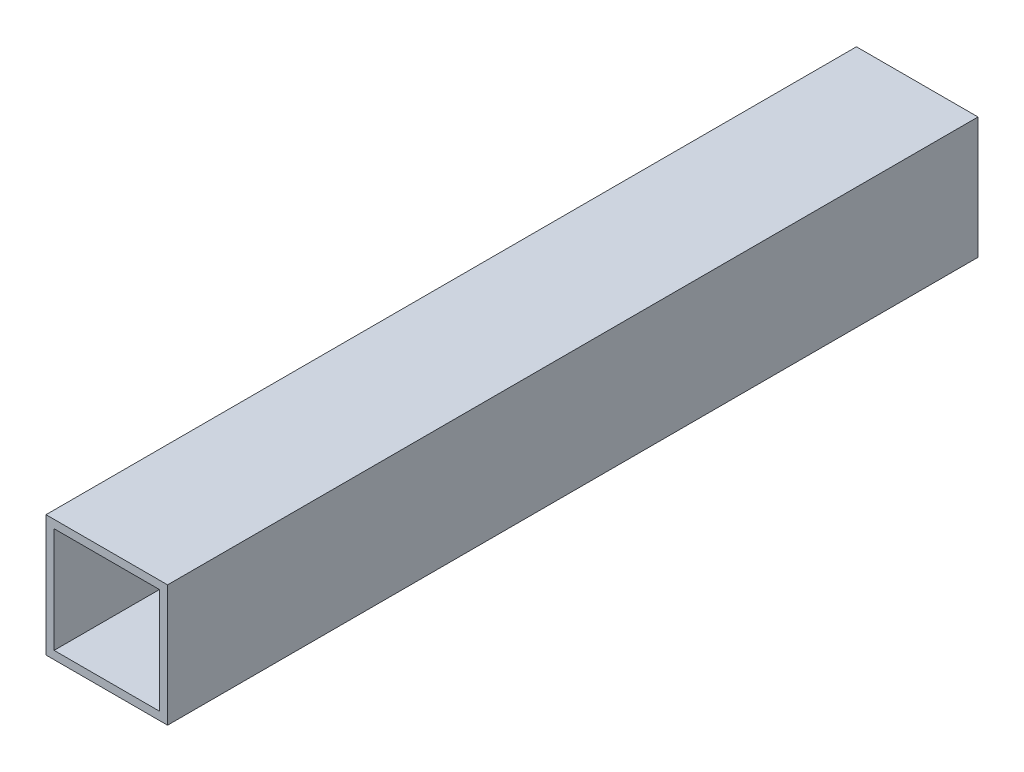
ISO-10303-21;
HEADER;
FILE_DESCRIPTION(('STEP AP214'),'2;1');
FILE_NAME('part.step','',(''),(''),'','','');
FILE_SCHEMA(('AUTOMOTIVE_DESIGN { 1 0 10303 214 1 1 1 1 }'));
ENDSEC;
DATA;
#1=APPLICATION_CONTEXT('core data for automotive mechanical design processes');
#2=APPLICATION_PROTOCOL_DEFINITION('international standard','automotive_design',2000,#1);
#3=PRODUCT_CONTEXT('',#1,'mechanical');
#4=PRODUCT('Part','Part','',(#3));
#5=PRODUCT_RELATED_PRODUCT_CATEGORY('part','',(#4));
#6=PRODUCT_DEFINITION_FORMATION('','',#4);
#7=PRODUCT_DEFINITION_CONTEXT('part definition',#1,'design');
#8=PRODUCT_DEFINITION('design','',#6,#7);
#9=PRODUCT_DEFINITION_SHAPE('','',#8);
#10=(LENGTH_UNIT() NAMED_UNIT(*) SI_UNIT(.MILLI.,.METRE.));
#11=(NAMED_UNIT(*) PLANE_ANGLE_UNIT() SI_UNIT($,.RADIAN.));
#12=(NAMED_UNIT(*) SI_UNIT($,.STERADIAN.) SOLID_ANGLE_UNIT());
#13=UNCERTAINTY_MEASURE_WITH_UNIT(LENGTH_MEASURE(1.E-05),#10,'distance_accuracy_value','');
#14=(GEOMETRIC_REPRESENTATION_CONTEXT(3) GLOBAL_UNCERTAINTY_ASSIGNED_CONTEXT((#13)) GLOBAL_UNIT_ASSIGNED_CONTEXT((#10,
#11,#12)) REPRESENTATION_CONTEXT('',''));
#15=CARTESIAN_POINT('',(0.,0.,0.));
#16=DIRECTION('',(0.,0.,1.));
#17=DIRECTION('',(1.,0.,0.));
#18=AXIS2_PLACEMENT_3D('',#15,#16,#17);
#19=CARTESIAN_POINT('',(0.,0.,100.));
#20=DIRECTION('',(0.,0.,1.));
#21=DIRECTION('',(1.,0.,0.));
#22=AXIS2_PLACEMENT_3D('',#19,#20,#21);
#23=PLANE('',#22);
#24=DIRECTION('',(0.,-1.,0.));
#25=VECTOR('',#24,1.);
#26=CARTESIAN_POINT('',(0.,0.,100.));
#27=LINE('',#26,#25);
#28=CARTESIAN_POINT('',(0.,0.,100.));
#29=VERTEX_POINT('',#28);
#30=CARTESIAN_POINT('',(0.,-15.,100.));
#31=VERTEX_POINT('',#30);
#32=EDGE_CURVE('E181',#29,#31,#27,.T.);
#33=ORIENTED_EDGE('',*,*,#32,.T.);
#34=DIRECTION('',(1.,0.,0.));
#35=VECTOR('',#34,1.);
#36=CARTESIAN_POINT('',(0.,-15.,100.));
#37=LINE('',#36,#35);
#38=CARTESIAN_POINT('',(15.,-15.,100.));
#39=VERTEX_POINT('',#38);
#40=EDGE_CURVE('E185',#31,#39,#37,.T.);
#41=ORIENTED_EDGE('',*,*,#40,.T.);
#42=DIRECTION('',(0.,1.,0.));
#43=VECTOR('',#42,1.);
#44=CARTESIAN_POINT('',(15.,0.,100.));
#45=LINE('',#44,#43);
#46=CARTESIAN_POINT('',(15.,0.,100.));
#47=VERTEX_POINT('',#46);
#48=EDGE_CURVE('E189',#39,#47,#45,.T.);
#49=ORIENTED_EDGE('',*,*,#48,.T.);
#50=DIRECTION('',(-1.,0.,0.));
#51=VECTOR('',#50,1.);
#52=CARTESIAN_POINT('',(0.,0.,100.));
#53=LINE('',#52,#51);
#54=EDGE_CURVE('E192',#47,#29,#53,.T.);
#55=ORIENTED_EDGE('',*,*,#54,.T.);
#56=EDGE_LOOP('',(#33,#41,#49,#55));
#57=FACE_BOUND('',#56,.T.);
#58=DIRECTION('',(1.,0.,0.));
#59=VECTOR('',#58,1.);
#60=CARTESIAN_POINT('',(0.,-14.,100.));
#61=LINE('',#60,#59);
#62=CARTESIAN_POINT('',(1.,-14.,100.));
#63=VERTEX_POINT('',#62);
#64=CARTESIAN_POINT('',(14.,-14.,100.));
#65=VERTEX_POINT('',#64);
#66=EDGE_CURVE('E142',#63,#65,#61,.T.);
#67=ORIENTED_EDGE('',*,*,#66,.F.);
#68=DIRECTION('',(0.,-1.,0.));
#69=VECTOR('',#68,1.);
#70=CARTESIAN_POINT('',(1.,0.,100.));
#71=LINE('',#70,#69);
#72=CARTESIAN_POINT('',(1.,-1.,100.));
#73=VERTEX_POINT('',#72);
#74=EDGE_CURVE('E133',#73,#63,#71,.T.);
#75=ORIENTED_EDGE('',*,*,#74,.F.);
#76=DIRECTION('',(-1.,0.,0.));
#77=VECTOR('',#76,1.);
#78=CARTESIAN_POINT('',(0.,-1.,100.));
#79=LINE('',#78,#77);
#80=CARTESIAN_POINT('',(14.,-1.,100.));
#81=VERTEX_POINT('',#80);
#82=EDGE_CURVE('E159',#81,#73,#79,.T.);
#83=ORIENTED_EDGE('',*,*,#82,.F.);
#84=DIRECTION('',(0.,1.,0.));
#85=VECTOR('',#84,1.);
#86=CARTESIAN_POINT('',(14.,0.,100.));
#87=LINE('',#86,#85);
#88=EDGE_CURVE('E155',#65,#81,#87,.T.);
#89=ORIENTED_EDGE('',*,*,#88,.F.);
#90=EDGE_LOOP('',(#67,#75,#83,#89));
#91=FACE_BOUND('',#90,.T.);
#92=ADVANCED_FACE('F67',(#57,#91),#23,.T.);
#93=CARTESIAN_POINT('',(0.,0.,0.));
#94=DIRECTION('',(0.,0.,1.));
#95=DIRECTION('',(1.,0.,0.));
#96=AXIS2_PLACEMENT_3D('',#93,#94,#95);
#97=PLANE('',#96);
#98=DIRECTION('',(0.,-1.,0.));
#99=VECTOR('',#98,1.);
#100=CARTESIAN_POINT('',(0.,0.,0.));
#101=LINE('',#100,#99);
#102=CARTESIAN_POINT('',(0.,0.,0.));
#103=VERTEX_POINT('',#102);
#104=CARTESIAN_POINT('',(0.,-15.,0.));
#105=VERTEX_POINT('',#104);
#106=EDGE_CURVE('E151',#103,#105,#101,.T.);
#107=ORIENTED_EDGE('',*,*,#106,.F.);
#108=DIRECTION('',(-1.,0.,0.));
#109=VECTOR('',#108,1.);
#110=CARTESIAN_POINT('',(0.,0.,0.));
#111=LINE('',#110,#109);
#112=CARTESIAN_POINT('',(15.,0.,0.));
#113=VERTEX_POINT('',#112);
#114=EDGE_CURVE('E186',#113,#103,#111,.T.);
#115=ORIENTED_EDGE('',*,*,#114,.F.);
#116=DIRECTION('',(0.,1.,0.));
#117=VECTOR('',#116,1.);
#118=CARTESIAN_POINT('',(15.,0.,0.));
#119=LINE('',#118,#117);
#120=CARTESIAN_POINT('',(15.,-15.,0.));
#121=VERTEX_POINT('',#120);
#122=EDGE_CURVE('E202',#121,#113,#119,.T.);
#123=ORIENTED_EDGE('',*,*,#122,.F.);
#124=DIRECTION('',(1.,0.,0.));
#125=VECTOR('',#124,1.);
#126=CARTESIAN_POINT('',(0.,-15.,0.));
#127=LINE('',#126,#125);
#128=EDGE_CURVE('E199',#105,#121,#127,.T.);
#129=ORIENTED_EDGE('',*,*,#128,.F.);
#130=EDGE_LOOP('',(#107,#115,#123,#129));
#131=FACE_BOUND('',#130,.T.);
#132=DIRECTION('',(0.,-1.,0.));
#133=VECTOR('',#132,1.);
#134=CARTESIAN_POINT('',(1.,0.,0.));
#135=LINE('',#134,#133);
#136=CARTESIAN_POINT('',(1.,-1.,0.));
#137=VERTEX_POINT('',#136);
#138=CARTESIAN_POINT('',(1.,-14.,0.));
#139=VERTEX_POINT('',#138);
#140=EDGE_CURVE('E91',#137,#139,#135,.T.);
#141=ORIENTED_EDGE('',*,*,#140,.T.);
#142=DIRECTION('',(1.,0.,0.));
#143=VECTOR('',#142,1.);
#144=CARTESIAN_POINT('',(0.,-14.,0.));
#145=LINE('',#144,#143);
#146=CARTESIAN_POINT('',(14.,-14.,0.));
#147=VERTEX_POINT('',#146);
#148=EDGE_CURVE('E149',#139,#147,#145,.T.);
#149=ORIENTED_EDGE('',*,*,#148,.T.);
#150=DIRECTION('',(0.,1.,0.));
#151=VECTOR('',#150,1.);
#152=CARTESIAN_POINT('',(14.,0.,0.));
#153=LINE('',#152,#151);
#154=CARTESIAN_POINT('',(14.,-1.,0.));
#155=VERTEX_POINT('',#154);
#156=EDGE_CURVE('E168',#147,#155,#153,.T.);
#157=ORIENTED_EDGE('',*,*,#156,.T.);
#158=DIRECTION('',(-1.,0.,0.));
#159=VECTOR('',#158,1.);
#160=CARTESIAN_POINT('',(0.,-1.,0.));
#161=LINE('',#160,#159);
#162=EDGE_CURVE('E143',#155,#137,#161,.T.);
#163=ORIENTED_EDGE('',*,*,#162,.T.);
#164=EDGE_LOOP('',(#141,#149,#157,#163));
#165=FACE_BOUND('',#164,.T.);
#166=ADVANCED_FACE('F225',(#131,#165),#97,.F.);
#167=CARTESIAN_POINT('',(0.,0.,100.));
#168=DIRECTION('',(1.,0.,0.));
#169=DIRECTION('',(0.,1.,0.));
#170=AXIS2_PLACEMENT_3D('',#167,#168,#169);
#171=PLANE('',#170);
#172=ORIENTED_EDGE('',*,*,#106,.T.);
#173=DIRECTION('',(0.,0.,-1.));
#174=VECTOR('',#173,1.);
#175=CARTESIAN_POINT('',(0.,-15.,100.));
#176=LINE('',#175,#174);
#177=EDGE_CURVE('E12',#31,#105,#176,.T.);
#178=ORIENTED_EDGE('',*,*,#177,.F.);
#179=ORIENTED_EDGE('',*,*,#32,.F.);
#180=DIRECTION('',(0.,0.,-1.));
#181=VECTOR('',#180,1.);
#182=CARTESIAN_POINT('',(0.,0.,100.));
#183=LINE('',#182,#181);
#184=EDGE_CURVE('E195',#29,#103,#183,.T.);
#185=ORIENTED_EDGE('',*,*,#184,.T.);
#186=EDGE_LOOP('',(#172,#178,#179,#185));
#187=FACE_BOUND('',#186,.T.);
#188=ADVANCED_FACE('F69',(#187),#171,.F.);
#189=CARTESIAN_POINT('',(0.,-15.,100.));
#190=DIRECTION('',(0.,1.,0.));
#191=DIRECTION('',(0.,0.,1.));
#192=AXIS2_PLACEMENT_3D('',#189,#190,#191);
#193=PLANE('',#192);
#194=ORIENTED_EDGE('',*,*,#128,.T.);
#195=DIRECTION('',(0.,0.,-1.));
#196=VECTOR('',#195,1.);
#197=CARTESIAN_POINT('',(15.,-15.,100.));
#198=LINE('',#197,#196);
#199=EDGE_CURVE('E76',#39,#121,#198,.T.);
#200=ORIENTED_EDGE('',*,*,#199,.F.);
#201=ORIENTED_EDGE('',*,*,#40,.F.);
#202=ORIENTED_EDGE('',*,*,#177,.T.);
#203=EDGE_LOOP('',(#194,#200,#201,#202));
#204=FACE_BOUND('',#203,.T.);
#205=ADVANCED_FACE('F235',(#204),#193,.F.);
#206=CARTESIAN_POINT('',(15.,0.,100.));
#207=DIRECTION('',(-1.,0.,0.));
#208=DIRECTION('',(0.,-1.,0.));
#209=AXIS2_PLACEMENT_3D('',#206,#207,#208);
#210=PLANE('',#209);
#211=ORIENTED_EDGE('',*,*,#122,.T.);
#212=DIRECTION('',(0.,0.,-1.));
#213=VECTOR('',#212,1.);
#214=CARTESIAN_POINT('',(15.,0.,100.));
#215=LINE('',#214,#213);
#216=EDGE_CURVE('E210',#47,#113,#215,.T.);
#217=ORIENTED_EDGE('',*,*,#216,.F.);
#218=ORIENTED_EDGE('',*,*,#48,.F.);
#219=ORIENTED_EDGE('',*,*,#199,.T.);
#220=EDGE_LOOP('',(#211,#217,#218,#219));
#221=FACE_BOUND('',#220,.T.);
#222=ADVANCED_FACE('F219',(#221),#210,.F.);
#223=CARTESIAN_POINT('',(0.,0.,100.));
#224=DIRECTION('',(0.,-1.,0.));
#225=DIRECTION('',(0.,0.,-1.));
#226=AXIS2_PLACEMENT_3D('',#223,#224,#225);
#227=PLANE('',#226);
#228=ORIENTED_EDGE('',*,*,#114,.T.);
#229=ORIENTED_EDGE('',*,*,#184,.F.);
#230=ORIENTED_EDGE('',*,*,#54,.F.);
#231=ORIENTED_EDGE('',*,*,#216,.T.);
#232=EDGE_LOOP('',(#228,#229,#230,#231));
#233=FACE_BOUND('',#232,.T.);
#234=ADVANCED_FACE('F229',(#233),#227,.F.);
#235=CARTESIAN_POINT('',(1.,0.,100.));
#236=DIRECTION('',(1.,0.,0.));
#237=DIRECTION('',(0.,1.,0.));
#238=AXIS2_PLACEMENT_3D('',#235,#236,#237);
#239=PLANE('',#238);
#240=ORIENTED_EDGE('',*,*,#140,.F.);
#241=DIRECTION('',(0.,0.,-1.));
#242=VECTOR('',#241,1.);
#243=CARTESIAN_POINT('',(1.,-1.,100.));
#244=LINE('',#243,#242);
#245=EDGE_CURVE('E137',#73,#137,#244,.T.);
#246=ORIENTED_EDGE('',*,*,#245,.F.);
#247=ORIENTED_EDGE('',*,*,#74,.T.);
#248=DIRECTION('',(0.,0.,-1.));
#249=VECTOR('',#248,1.);
#250=CARTESIAN_POINT('',(1.,-14.,100.));
#251=LINE('',#250,#249);
#252=EDGE_CURVE('E136',#63,#139,#251,.T.);
#253=ORIENTED_EDGE('',*,*,#252,.T.);
#254=EDGE_LOOP('',(#240,#246,#247,#253));
#255=FACE_BOUND('',#254,.T.);
#256=ADVANCED_FACE('F135',(#255),#239,.T.);
#257=CARTESIAN_POINT('',(0.,-14.,100.));
#258=DIRECTION('',(0.,1.,0.));
#259=DIRECTION('',(0.,0.,1.));
#260=AXIS2_PLACEMENT_3D('',#257,#258,#259);
#261=PLANE('',#260);
#262=ORIENTED_EDGE('',*,*,#148,.F.);
#263=ORIENTED_EDGE('',*,*,#252,.F.);
#264=ORIENTED_EDGE('',*,*,#66,.T.);
#265=DIRECTION('',(0.,0.,-1.));
#266=VECTOR('',#265,1.);
#267=CARTESIAN_POINT('',(14.,-14.,100.));
#268=LINE('',#267,#266);
#269=EDGE_CURVE('E152',#65,#147,#268,.T.);
#270=ORIENTED_EDGE('',*,*,#269,.T.);
#271=EDGE_LOOP('',(#262,#263,#264,#270));
#272=FACE_BOUND('',#271,.T.);
#273=ADVANCED_FACE('F146',(#272),#261,.T.);
#274=CARTESIAN_POINT('',(14.,0.,100.));
#275=DIRECTION('',(-1.,0.,0.));
#276=DIRECTION('',(0.,-1.,0.));
#277=AXIS2_PLACEMENT_3D('',#274,#275,#276);
#278=PLANE('',#277);
#279=ORIENTED_EDGE('',*,*,#156,.F.);
#280=ORIENTED_EDGE('',*,*,#269,.F.);
#281=ORIENTED_EDGE('',*,*,#88,.T.);
#282=DIRECTION('',(0.,0.,-1.));
#283=VECTOR('',#282,1.);
#284=CARTESIAN_POINT('',(14.,-1.,100.));
#285=LINE('',#284,#283);
#286=EDGE_CURVE('E83',#81,#155,#285,.T.);
#287=ORIENTED_EDGE('',*,*,#286,.T.);
#288=EDGE_LOOP('',(#279,#280,#281,#287));
#289=FACE_BOUND('',#288,.T.);
#290=ADVANCED_FACE('F258',(#289),#278,.T.);
#291=CARTESIAN_POINT('',(0.,-1.,100.));
#292=DIRECTION('',(0.,-1.,0.));
#293=DIRECTION('',(0.,0.,-1.));
#294=AXIS2_PLACEMENT_3D('',#291,#292,#293);
#295=PLANE('',#294);
#296=ORIENTED_EDGE('',*,*,#162,.F.);
#297=ORIENTED_EDGE('',*,*,#286,.F.);
#298=ORIENTED_EDGE('',*,*,#82,.T.);
#299=ORIENTED_EDGE('',*,*,#245,.T.);
#300=EDGE_LOOP('',(#296,#297,#298,#299));
#301=FACE_BOUND('',#300,.T.);
#302=ADVANCED_FACE('F262',(#301),#295,.T.);
#303=CLOSED_SHELL('',(#92,#166,#188,#205,#222,#234,#256,#273,#290,#302));
#304=MANIFOLD_SOLID_BREP('B2',#303);
#305=ADVANCED_BREP_SHAPE_REPRESENTATION('',(#18,#304),#14);
#306=SHAPE_DEFINITION_REPRESENTATION(#9,#305);
ENDSEC;
END-ISO-10303-21;
